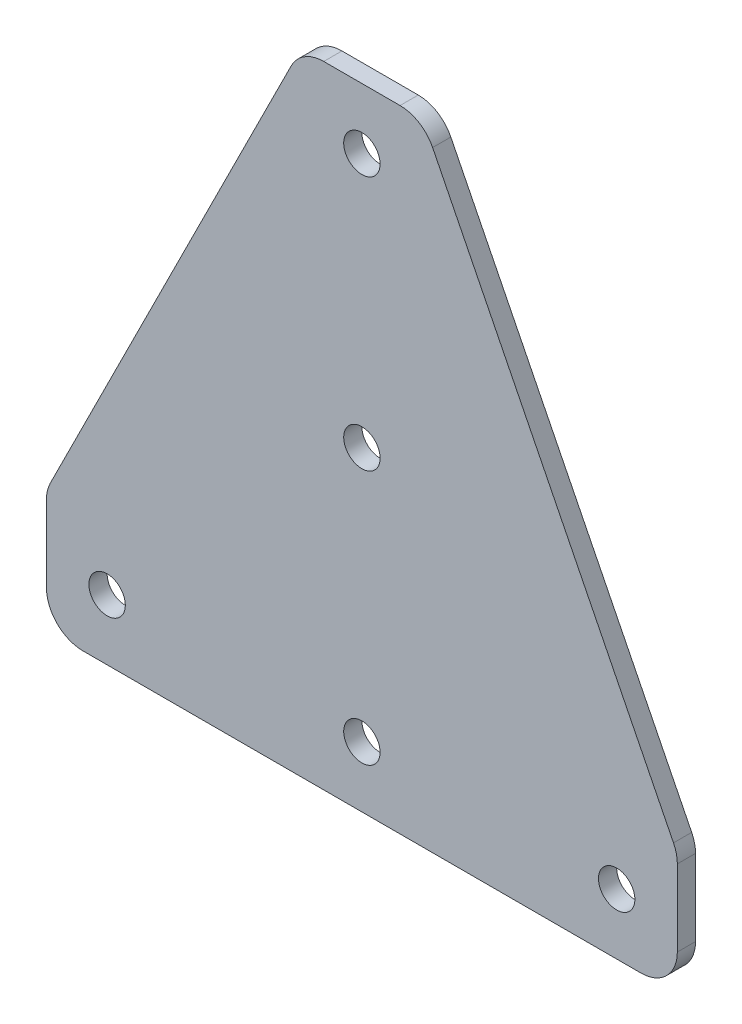
ISO-10303-21;
HEADER;
FILE_DESCRIPTION(('STEP AP214'),'2;1');
FILE_NAME('part.step','',(''),(''),'','','');
FILE_SCHEMA(('AUTOMOTIVE_DESIGN { 1 0 10303 214 1 1 1 1 }'));
ENDSEC;
DATA;
#1=APPLICATION_CONTEXT('core data for automotive mechanical design processes');
#2=APPLICATION_PROTOCOL_DEFINITION('international standard','automotive_design',2000,#1);
#3=PRODUCT_CONTEXT('',#1,'mechanical');
#4=PRODUCT('Part','Part','',(#3));
#5=PRODUCT_RELATED_PRODUCT_CATEGORY('part','',(#4));
#6=PRODUCT_DEFINITION_FORMATION('','',#4);
#7=PRODUCT_DEFINITION_CONTEXT('part definition',#1,'design');
#8=PRODUCT_DEFINITION('design','',#6,#7);
#9=PRODUCT_DEFINITION_SHAPE('','',#8);
#10=(LENGTH_UNIT() NAMED_UNIT(*) SI_UNIT(.MILLI.,.METRE.));
#11=(NAMED_UNIT(*) PLANE_ANGLE_UNIT() SI_UNIT($,.RADIAN.));
#12=(NAMED_UNIT(*) SI_UNIT($,.STERADIAN.) SOLID_ANGLE_UNIT());
#13=UNCERTAINTY_MEASURE_WITH_UNIT(LENGTH_MEASURE(1.E-05),#10,'distance_accuracy_value','');
#14=(GEOMETRIC_REPRESENTATION_CONTEXT(3) GLOBAL_UNCERTAINTY_ASSIGNED_CONTEXT((#13)) GLOBAL_UNIT_ASSIGNED_CONTEXT((#10,
#11,#12)) REPRESENTATION_CONTEXT('',''));
#15=CARTESIAN_POINT('',(0.,0.,0.));
#16=DIRECTION('',(0.,0.,1.));
#17=DIRECTION('',(1.,0.,0.));
#18=AXIS2_PLACEMENT_3D('',#15,#16,#17);
#19=CARTESIAN_POINT('',(0.,0.,1.5));
#20=DIRECTION('',(0.,0.,1.));
#21=DIRECTION('',(1.,0.,0.));
#22=AXIS2_PLACEMENT_3D('',#19,#20,#21);
#23=PLANE('',#22);
#24=DIRECTION('',(-1.,0.,0.));
#25=VECTOR('',#24,1.);
#26=CARTESIAN_POINT('',(-26.,47.,1.5));
#27=LINE('',#26,#25);
#28=CARTESIAN_POINT('',(3.14589803375032,47.,1.5));
#29=VERTEX_POINT('',#28);
#30=CARTESIAN_POINT('',(-3.14589803375032,47.,1.5));
#31=VERTEX_POINT('',#30);
#32=EDGE_CURVE('E124',#29,#31,#27,.T.);
#33=ORIENTED_EDGE('',*,*,#32,.T.);
#34=CARTESIAN_POINT('',(-3.14589803375032,44.,1.5));
#35=DIRECTION('',(0.,0.,1.));
#36=DIRECTION('',(1.,0.,0.));
#37=AXIS2_PLACEMENT_3D('',#34,#35,#36);
#38=CIRCLE('',#37,3.);
#39=CARTESIAN_POINT('',(-5.82917960675006,45.3416407864999,1.5));
#40=VERTEX_POINT('',#39);
#41=EDGE_CURVE('E159',#31,#40,#38,.T.);
#42=ORIENTED_EDGE('',*,*,#41,.T.);
#43=DIRECTION('',(0.447213595499958,0.894427190999916,0.));
#44=VECTOR('',#43,1.);
#45=CARTESIAN_POINT('',(-5.,47.,1.5));
#46=LINE('',#45,#44);
#47=CARTESIAN_POINT('',(-25.6832815729997,5.63343685400054,1.5));
#48=VERTEX_POINT('',#47);
#49=EDGE_CURVE('E251',#48,#40,#46,.T.);
#50=ORIENTED_EDGE('',*,*,#49,.F.);
#51=CARTESIAN_POINT('',(-23.,4.29179606750065,1.5));
#52=DIRECTION('',(0.,0.,1.));
#53=DIRECTION('',(1.,0.,0.));
#54=AXIS2_PLACEMENT_3D('',#51,#52,#53);
#55=CIRCLE('',#54,3.);
#56=CARTESIAN_POINT('',(-26.,4.29179606750067,1.5));
#57=VERTEX_POINT('',#56);
#58=EDGE_CURVE('E132',#48,#57,#55,.T.);
#59=ORIENTED_EDGE('',*,*,#58,.T.);
#60=DIRECTION('',(0.,-1.,0.));
#61=VECTOR('',#60,1.);
#62=CARTESIAN_POINT('',(-26.,47.,1.5));
#63=LINE('',#62,#61);
#64=CARTESIAN_POINT('',(-26.,-1.99999999999998,1.5));
#65=VERTEX_POINT('',#64);
#66=EDGE_CURVE('E193',#57,#65,#63,.T.);
#67=ORIENTED_EDGE('',*,*,#66,.T.);
#68=CARTESIAN_POINT('',(-23.,-2.,1.5));
#69=DIRECTION('',(0.,0.,1.));
#70=DIRECTION('',(1.,0.,0.));
#71=AXIS2_PLACEMENT_3D('',#68,#69,#70);
#72=CIRCLE('',#71,3.);
#73=CARTESIAN_POINT('',(-23.,-5.,1.5));
#74=VERTEX_POINT('',#73);
#75=EDGE_CURVE('E148',#65,#74,#72,.T.);
#76=ORIENTED_EDGE('',*,*,#75,.T.);
#77=DIRECTION('',(1.,0.,0.));
#78=VECTOR('',#77,1.);
#79=CARTESIAN_POINT('',(-26.,-5.,1.5));
#80=LINE('',#79,#78);
#81=CARTESIAN_POINT('',(23.,-5.,1.5));
#82=VERTEX_POINT('',#81);
#83=EDGE_CURVE('E200',#74,#82,#80,.T.);
#84=ORIENTED_EDGE('',*,*,#83,.T.);
#85=CARTESIAN_POINT('',(23.,-1.99999999999999,1.5));
#86=DIRECTION('',(0.,0.,1.));
#87=DIRECTION('',(1.,0.,0.));
#88=AXIS2_PLACEMENT_3D('',#85,#86,#87);
#89=CIRCLE('',#88,3.);
#90=CARTESIAN_POINT('',(26.,-1.99999999999998,1.5));
#91=VERTEX_POINT('',#90);
#92=EDGE_CURVE('E157',#82,#91,#89,.T.);
#93=ORIENTED_EDGE('',*,*,#92,.T.);
#94=DIRECTION('',(0.,1.,0.));
#95=VECTOR('',#94,1.);
#96=CARTESIAN_POINT('',(26.,47.,1.5));
#97=LINE('',#96,#95);
#98=CARTESIAN_POINT('',(26.,4.29179606750065,1.5));
#99=VERTEX_POINT('',#98);
#100=EDGE_CURVE('E142',#91,#99,#97,.T.);
#101=ORIENTED_EDGE('',*,*,#100,.T.);
#102=CARTESIAN_POINT('',(23.,4.29179606750064,1.5));
#103=DIRECTION('',(0.,0.,1.));
#104=DIRECTION('',(1.,0.,0.));
#105=AXIS2_PLACEMENT_3D('',#102,#103,#104);
#106=CIRCLE('',#105,3.);
#107=CARTESIAN_POINT('',(25.6832815729997,5.63343685400051,1.5));
#108=VERTEX_POINT('',#107);
#109=EDGE_CURVE('E131',#99,#108,#106,.T.);
#110=ORIENTED_EDGE('',*,*,#109,.T.);
#111=DIRECTION('',(0.447213595499958,-0.894427190999916,0.));
#112=VECTOR('',#111,1.);
#113=CARTESIAN_POINT('',(26.,5.,1.5));
#114=LINE('',#113,#112);
#115=CARTESIAN_POINT('',(5.82917960675006,45.3416407864999,1.5));
#116=VERTEX_POINT('',#115);
#117=EDGE_CURVE('E126',#116,#108,#114,.T.);
#118=ORIENTED_EDGE('',*,*,#117,.F.);
#119=CARTESIAN_POINT('',(3.14589803375032,44.,1.5));
#120=DIRECTION('',(0.,0.,1.));
#121=DIRECTION('',(1.,0.,0.));
#122=AXIS2_PLACEMENT_3D('',#119,#120,#121);
#123=CIRCLE('',#122,3.);
#124=EDGE_CURVE('E121',#116,#29,#123,.T.);
#125=ORIENTED_EDGE('',*,*,#124,.T.);
#126=EDGE_LOOP('',(#33,#42,#50,#59,#67,#76,#84,#93,#101,#110,#118,#125));
#127=FACE_BOUND('',#126,.T.);
#128=CARTESIAN_POINT('',(0.,42.,1.5));
#129=DIRECTION('',(0.,0.,1.));
#130=DIRECTION('',(1.,0.,0.));
#131=AXIS2_PLACEMENT_3D('',#128,#129,#130);
#132=CIRCLE('',#131,1.5);
#133=CARTESIAN_POINT('',(1.5,42.,1.5));
#134=VERTEX_POINT('',#133);
#135=EDGE_CURVE('E236',#134,#134,#132,.T.);
#136=ORIENTED_EDGE('',*,*,#135,.F.);
#137=EDGE_LOOP('',(#136));
#138=FACE_BOUND('',#137,.T.);
#139=CARTESIAN_POINT('',(0.,0.,1.5));
#140=DIRECTION('',(0.,0.,1.));
#141=DIRECTION('',(1.,0.,0.));
#142=AXIS2_PLACEMENT_3D('',#139,#140,#141);
#143=CIRCLE('',#142,1.5);
#144=CARTESIAN_POINT('',(1.5,0.,1.5));
#145=VERTEX_POINT('',#144);
#146=EDGE_CURVE('E224',#145,#145,#143,.T.);
#147=ORIENTED_EDGE('',*,*,#146,.F.);
#148=EDGE_LOOP('',(#147));
#149=FACE_BOUND('',#148,.T.);
#150=CARTESIAN_POINT('',(-21.,0.,1.5));
#151=DIRECTION('',(0.,0.,1.));
#152=DIRECTION('',(1.,0.,0.));
#153=AXIS2_PLACEMENT_3D('',#150,#151,#152);
#154=CIRCLE('',#153,1.5);
#155=CARTESIAN_POINT('',(-19.5,0.,1.5));
#156=VERTEX_POINT('',#155);
#157=EDGE_CURVE('E215',#156,#156,#154,.T.);
#158=ORIENTED_EDGE('',*,*,#157,.F.);
#159=EDGE_LOOP('',(#158));
#160=FACE_BOUND('',#159,.T.);
#161=CARTESIAN_POINT('',(21.,0.,1.5));
#162=DIRECTION('',(0.,0.,1.));
#163=DIRECTION('',(1.,0.,0.));
#164=AXIS2_PLACEMENT_3D('',#161,#162,#163);
#165=CIRCLE('',#164,1.5);
#166=CARTESIAN_POINT('',(22.5,0.,1.5));
#167=VERTEX_POINT('',#166);
#168=EDGE_CURVE('E230',#167,#167,#165,.T.);
#169=ORIENTED_EDGE('',*,*,#168,.F.);
#170=EDGE_LOOP('',(#169));
#171=FACE_BOUND('',#170,.T.);
#172=CARTESIAN_POINT('',(0.,21.,1.5));
#173=DIRECTION('',(0.,0.,1.));
#174=DIRECTION('',(1.,0.,0.));
#175=AXIS2_PLACEMENT_3D('',#172,#173,#174);
#176=CIRCLE('',#175,1.5);
#177=CARTESIAN_POINT('',(1.5,21.,1.5));
#178=VERTEX_POINT('',#177);
#179=EDGE_CURVE('E242',#178,#178,#176,.T.);
#180=ORIENTED_EDGE('',*,*,#179,.F.);
#181=EDGE_LOOP('',(#180));
#182=FACE_BOUND('',#181,.T.);
#183=ADVANCED_FACE('F33',(#127,#138,#149,#160,#171,#182),#23,.T.);
#184=CARTESIAN_POINT('',(0.,0.,0.));
#185=DIRECTION('',(0.,0.,1.));
#186=DIRECTION('',(1.,0.,0.));
#187=AXIS2_PLACEMENT_3D('',#184,#185,#186);
#188=PLANE('',#187);
#189=CARTESIAN_POINT('',(0.,42.,0.));
#190=DIRECTION('',(0.,0.,1.));
#191=DIRECTION('',(1.,0.,0.));
#192=AXIS2_PLACEMENT_3D('',#189,#190,#191);
#193=CIRCLE('',#192,1.5);
#194=CARTESIAN_POINT('',(1.5,42.,0.));
#195=VERTEX_POINT('',#194);
#196=EDGE_CURVE('E239',#195,#195,#193,.T.);
#197=ORIENTED_EDGE('',*,*,#196,.T.);
#198=EDGE_LOOP('',(#197));
#199=FACE_BOUND('',#198,.T.);
#200=CARTESIAN_POINT('',(0.,0.,0.));
#201=DIRECTION('',(0.,0.,1.));
#202=DIRECTION('',(1.,0.,0.));
#203=AXIS2_PLACEMENT_3D('',#200,#201,#202);
#204=CIRCLE('',#203,1.5);
#205=CARTESIAN_POINT('',(1.5,0.,0.));
#206=VERTEX_POINT('',#205);
#207=EDGE_CURVE('E227',#206,#206,#204,.T.);
#208=ORIENTED_EDGE('',*,*,#207,.T.);
#209=EDGE_LOOP('',(#208));
#210=FACE_BOUND('',#209,.T.);
#211=DIRECTION('',(0.447213595499958,0.894427190999916,0.));
#212=VECTOR('',#211,1.);
#213=CARTESIAN_POINT('',(-5.,47.,0.));
#214=LINE('',#213,#212);
#215=CARTESIAN_POINT('',(-25.6832815729997,5.63343685400054,0.));
#216=VERTEX_POINT('',#215);
#217=CARTESIAN_POINT('',(-5.82917960675006,45.3416407864999,0.));
#218=VERTEX_POINT('',#217);
#219=EDGE_CURVE('E248',#216,#218,#214,.T.);
#220=ORIENTED_EDGE('',*,*,#219,.T.);
#221=CARTESIAN_POINT('',(-3.14589803375032,44.,0.));
#222=DIRECTION('',(0.,0.,1.));
#223=DIRECTION('',(1.,0.,0.));
#224=AXIS2_PLACEMENT_3D('',#221,#222,#223);
#225=CIRCLE('',#224,3.);
#226=CARTESIAN_POINT('',(-3.14589803375032,47.,0.));
#227=VERTEX_POINT('',#226);
#228=EDGE_CURVE('E174',#218,#227,#225,.F.);
#229=ORIENTED_EDGE('',*,*,#228,.T.);
#230=DIRECTION('',(-1.,0.,0.));
#231=VECTOR('',#230,1.);
#232=CARTESIAN_POINT('',(-26.,47.,0.));
#233=LINE('',#232,#231);
#234=CARTESIAN_POINT('',(3.14589803375032,47.,0.));
#235=VERTEX_POINT('',#234);
#236=EDGE_CURVE('E151',#235,#227,#233,.T.);
#237=ORIENTED_EDGE('',*,*,#236,.F.);
#238=CARTESIAN_POINT('',(3.14589803375032,44.,0.));
#239=DIRECTION('',(0.,0.,1.));
#240=DIRECTION('',(1.,0.,0.));
#241=AXIS2_PLACEMENT_3D('',#238,#239,#240);
#242=CIRCLE('',#241,3.);
#243=CARTESIAN_POINT('',(5.82917960675006,45.3416407864999,0.));
#244=VERTEX_POINT('',#243);
#245=EDGE_CURVE('E146',#235,#244,#242,.F.);
#246=ORIENTED_EDGE('',*,*,#245,.T.);
#247=DIRECTION('',(0.447213595499958,-0.894427190999916,0.));
#248=VECTOR('',#247,1.);
#249=CARTESIAN_POINT('',(26.,5.,0.));
#250=LINE('',#249,#248);
#251=CARTESIAN_POINT('',(25.6832815729997,5.63343685400051,0.));
#252=VERTEX_POINT('',#251);
#253=EDGE_CURVE('E254',#244,#252,#250,.T.);
#254=ORIENTED_EDGE('',*,*,#253,.T.);
#255=CARTESIAN_POINT('',(23.,4.29179606750064,0.));
#256=DIRECTION('',(0.,0.,1.));
#257=DIRECTION('',(1.,0.,0.));
#258=AXIS2_PLACEMENT_3D('',#255,#256,#257);
#259=CIRCLE('',#258,3.);
#260=CARTESIAN_POINT('',(26.,4.29179606750065,0.));
#261=VERTEX_POINT('',#260);
#262=EDGE_CURVE('E170',#252,#261,#259,.F.);
#263=ORIENTED_EDGE('',*,*,#262,.T.);
#264=DIRECTION('',(0.,1.,0.));
#265=VECTOR('',#264,1.);
#266=CARTESIAN_POINT('',(26.,47.,0.));
#267=LINE('',#266,#265);
#268=CARTESIAN_POINT('',(26.,-1.99999999999998,0.));
#269=VERTEX_POINT('',#268);
#270=EDGE_CURVE('E212',#269,#261,#267,.T.);
#271=ORIENTED_EDGE('',*,*,#270,.F.);
#272=CARTESIAN_POINT('',(23.,-1.99999999999999,0.));
#273=DIRECTION('',(0.,0.,1.));
#274=DIRECTION('',(1.,0.,0.));
#275=AXIS2_PLACEMENT_3D('',#272,#273,#274);
#276=CIRCLE('',#275,3.);
#277=CARTESIAN_POINT('',(23.,-5.,0.));
#278=VERTEX_POINT('',#277);
#279=EDGE_CURVE('E172',#269,#278,#276,.F.);
#280=ORIENTED_EDGE('',*,*,#279,.T.);
#281=DIRECTION('',(1.,0.,0.));
#282=VECTOR('',#281,1.);
#283=CARTESIAN_POINT('',(-26.,-5.,0.));
#284=LINE('',#283,#282);
#285=CARTESIAN_POINT('',(-23.,-5.,0.));
#286=VERTEX_POINT('',#285);
#287=EDGE_CURVE('E206',#286,#278,#284,.T.);
#288=ORIENTED_EDGE('',*,*,#287,.F.);
#289=CARTESIAN_POINT('',(-23.,-2.,0.));
#290=DIRECTION('',(0.,0.,1.));
#291=DIRECTION('',(1.,0.,0.));
#292=AXIS2_PLACEMENT_3D('',#289,#290,#291);
#293=CIRCLE('',#292,3.);
#294=CARTESIAN_POINT('',(-26.,-1.99999999999998,0.));
#295=VERTEX_POINT('',#294);
#296=EDGE_CURVE('E48',#286,#295,#293,.F.);
#297=ORIENTED_EDGE('',*,*,#296,.T.);
#298=DIRECTION('',(0.,-1.,0.));
#299=VECTOR('',#298,1.);
#300=CARTESIAN_POINT('',(-26.,47.,0.));
#301=LINE('',#300,#299);
#302=CARTESIAN_POINT('',(-26.,4.29179606750067,0.));
#303=VERTEX_POINT('',#302);
#304=EDGE_CURVE('E194',#303,#295,#301,.T.);
#305=ORIENTED_EDGE('',*,*,#304,.F.);
#306=CARTESIAN_POINT('',(-23.,4.29179606750065,0.));
#307=DIRECTION('',(0.,0.,1.));
#308=DIRECTION('',(1.,0.,0.));
#309=AXIS2_PLACEMENT_3D('',#306,#307,#308);
#310=CIRCLE('',#309,3.);
#311=EDGE_CURVE('E167',#303,#216,#310,.F.);
#312=ORIENTED_EDGE('',*,*,#311,.T.);
#313=EDGE_LOOP('',(#220,#229,#237,#246,#254,#263,#271,#280,#288,#297,#305,#312));
#314=FACE_BOUND('',#313,.T.);
#315=CARTESIAN_POINT('',(-21.,0.,0.));
#316=DIRECTION('',(0.,0.,1.));
#317=DIRECTION('',(1.,0.,0.));
#318=AXIS2_PLACEMENT_3D('',#315,#316,#317);
#319=CIRCLE('',#318,1.5);
#320=CARTESIAN_POINT('',(-19.5,0.,0.));
#321=VERTEX_POINT('',#320);
#322=EDGE_CURVE('E221',#321,#321,#319,.T.);
#323=ORIENTED_EDGE('',*,*,#322,.T.);
#324=EDGE_LOOP('',(#323));
#325=FACE_BOUND('',#324,.T.);
#326=CARTESIAN_POINT('',(21.,0.,0.));
#327=DIRECTION('',(0.,0.,1.));
#328=DIRECTION('',(1.,0.,0.));
#329=AXIS2_PLACEMENT_3D('',#326,#327,#328);
#330=CIRCLE('',#329,1.5);
#331=CARTESIAN_POINT('',(22.5,0.,0.));
#332=VERTEX_POINT('',#331);
#333=EDGE_CURVE('E233',#332,#332,#330,.T.);
#334=ORIENTED_EDGE('',*,*,#333,.T.);
#335=EDGE_LOOP('',(#334));
#336=FACE_BOUND('',#335,.T.);
#337=CARTESIAN_POINT('',(0.,21.,0.));
#338=DIRECTION('',(0.,0.,1.));
#339=DIRECTION('',(1.,0.,0.));
#340=AXIS2_PLACEMENT_3D('',#337,#338,#339);
#341=CIRCLE('',#340,1.5);
#342=CARTESIAN_POINT('',(1.5,21.,0.));
#343=VERTEX_POINT('',#342);
#344=EDGE_CURVE('E245',#343,#343,#341,.T.);
#345=ORIENTED_EDGE('',*,*,#344,.T.);
#346=EDGE_LOOP('',(#345));
#347=FACE_BOUND('',#346,.T.);
#348=ADVANCED_FACE('F209',(#199,#210,#314,#325,#336,#347),#188,.F.);
#349=CARTESIAN_POINT('',(-26.,47.,1.5));
#350=DIRECTION('',(1.,0.,0.));
#351=DIRECTION('',(0.,1.,0.));
#352=AXIS2_PLACEMENT_3D('',#349,#350,#351);
#353=PLANE('',#352);
#354=ORIENTED_EDGE('',*,*,#66,.F.);
#355=DIRECTION('',(0.,0.,1.));
#356=VECTOR('',#355,1.);
#357=CARTESIAN_POINT('',(-26.,4.29179606750065,1.5));
#358=LINE('',#357,#356);
#359=EDGE_CURVE('E11',#57,#303,#358,.F.);
#360=ORIENTED_EDGE('',*,*,#359,.T.);
#361=ORIENTED_EDGE('',*,*,#304,.T.);
#362=DIRECTION('',(0.,0.,-1.));
#363=VECTOR('',#362,1.);
#364=CARTESIAN_POINT('',(-26.,-1.99999999999999,1.5));
#365=LINE('',#364,#363);
#366=EDGE_CURVE('E41',#295,#65,#365,.F.);
#367=ORIENTED_EDGE('',*,*,#366,.T.);
#368=EDGE_LOOP('',(#354,#360,#361,#367));
#369=FACE_BOUND('',#368,.T.);
#370=ADVANCED_FACE('F192',(#369),#353,.F.);
#371=CARTESIAN_POINT('',(-26.,-5.,1.5));
#372=DIRECTION('',(0.,1.,0.));
#373=DIRECTION('',(0.,0.,1.));
#374=AXIS2_PLACEMENT_3D('',#371,#372,#373);
#375=PLANE('',#374);
#376=ORIENTED_EDGE('',*,*,#287,.T.);
#377=DIRECTION('',(0.,0.,-1.));
#378=VECTOR('',#377,1.);
#379=CARTESIAN_POINT('',(23.,-5.,1.5));
#380=LINE('',#379,#378);
#381=EDGE_CURVE('E185',#278,#82,#380,.F.);
#382=ORIENTED_EDGE('',*,*,#381,.T.);
#383=ORIENTED_EDGE('',*,*,#83,.F.);
#384=DIRECTION('',(0.,0.,-1.));
#385=VECTOR('',#384,1.);
#386=CARTESIAN_POINT('',(-23.,-5.,1.5));
#387=LINE('',#386,#385);
#388=EDGE_CURVE('E182',#74,#286,#387,.T.);
#389=ORIENTED_EDGE('',*,*,#388,.T.);
#390=EDGE_LOOP('',(#376,#382,#383,#389));
#391=FACE_BOUND('',#390,.T.);
#392=ADVANCED_FACE('F205',(#391),#375,.F.);
#393=CARTESIAN_POINT('',(26.,47.,1.5));
#394=DIRECTION('',(-1.,0.,0.));
#395=DIRECTION('',(0.,-1.,0.));
#396=AXIS2_PLACEMENT_3D('',#393,#394,#395);
#397=PLANE('',#396);
#398=ORIENTED_EDGE('',*,*,#100,.F.);
#399=DIRECTION('',(0.,0.,-1.));
#400=VECTOR('',#399,1.);
#401=CARTESIAN_POINT('',(26.,-1.99999999999999,1.5));
#402=LINE('',#401,#400);
#403=EDGE_CURVE('E179',#91,#269,#402,.T.);
#404=ORIENTED_EDGE('',*,*,#403,.T.);
#405=ORIENTED_EDGE('',*,*,#270,.T.);
#406=DIRECTION('',(0.,0.,1.));
#407=VECTOR('',#406,1.);
#408=CARTESIAN_POINT('',(26.,4.29179606750064,1.5));
#409=LINE('',#408,#407);
#410=EDGE_CURVE('E176',#261,#99,#409,.T.);
#411=ORIENTED_EDGE('',*,*,#410,.T.);
#412=EDGE_LOOP('',(#398,#404,#405,#411));
#413=FACE_BOUND('',#412,.T.);
#414=ADVANCED_FACE('F267',(#413),#397,.F.);
#415=CARTESIAN_POINT('',(-26.,47.,1.5));
#416=DIRECTION('',(0.,-1.,0.));
#417=DIRECTION('',(0.,0.,-1.));
#418=AXIS2_PLACEMENT_3D('',#415,#416,#417);
#419=PLANE('',#418);
#420=ORIENTED_EDGE('',*,*,#236,.T.);
#421=DIRECTION('',(0.,0.,1.));
#422=VECTOR('',#421,1.);
#423=CARTESIAN_POINT('',(-3.14589803375032,47.,1.5));
#424=LINE('',#423,#422);
#425=EDGE_CURVE('E141',#227,#31,#424,.T.);
#426=ORIENTED_EDGE('',*,*,#425,.T.);
#427=ORIENTED_EDGE('',*,*,#32,.F.);
#428=DIRECTION('',(0.,0.,1.));
#429=VECTOR('',#428,1.);
#430=CARTESIAN_POINT('',(3.14589803375032,47.,1.5));
#431=LINE('',#430,#429);
#432=EDGE_CURVE('E138',#29,#235,#431,.F.);
#433=ORIENTED_EDGE('',*,*,#432,.T.);
#434=EDGE_LOOP('',(#420,#426,#427,#433));
#435=FACE_BOUND('',#434,.T.);
#436=ADVANCED_FACE('F137',(#435),#419,.F.);
#437=CARTESIAN_POINT('',(-21.,0.,1.5));
#438=DIRECTION('',(0.,0.,-1.));
#439=DIRECTION('',(-1.,0.,0.));
#440=AXIS2_PLACEMENT_3D('',#437,#438,#439);
#441=CYLINDRICAL_SURFACE('',#440,1.5);
#442=ORIENTED_EDGE('',*,*,#157,.T.);
#443=EDGE_LOOP('',(#442));
#444=FACE_BOUND('',#443,.T.);
#445=ORIENTED_EDGE('',*,*,#322,.F.);
#446=EDGE_LOOP('',(#445));
#447=FACE_BOUND('',#446,.T.);
#448=ADVANCED_FACE('F291',(#444,#447),#441,.F.);
#449=CARTESIAN_POINT('',(0.,0.,1.5));
#450=DIRECTION('',(0.,0.,-1.));
#451=DIRECTION('',(-1.,0.,0.));
#452=AXIS2_PLACEMENT_3D('',#449,#450,#451);
#453=CYLINDRICAL_SURFACE('',#452,1.5);
#454=ORIENTED_EDGE('',*,*,#146,.T.);
#455=EDGE_LOOP('',(#454));
#456=FACE_BOUND('',#455,.T.);
#457=ORIENTED_EDGE('',*,*,#207,.F.);
#458=EDGE_LOOP('',(#457));
#459=FACE_BOUND('',#458,.T.);
#460=ADVANCED_FACE('F324',(#456,#459),#453,.F.);
#461=CARTESIAN_POINT('',(21.,0.,1.5));
#462=DIRECTION('',(0.,0.,-1.));
#463=DIRECTION('',(-1.,0.,0.));
#464=AXIS2_PLACEMENT_3D('',#461,#462,#463);
#465=CYLINDRICAL_SURFACE('',#464,1.5);
#466=ORIENTED_EDGE('',*,*,#168,.T.);
#467=EDGE_LOOP('',(#466));
#468=FACE_BOUND('',#467,.T.);
#469=ORIENTED_EDGE('',*,*,#333,.F.);
#470=EDGE_LOOP('',(#469));
#471=FACE_BOUND('',#470,.T.);
#472=ADVANCED_FACE('F331',(#468,#471),#465,.F.);
#473=CARTESIAN_POINT('',(0.,42.,1.5));
#474=DIRECTION('',(0.,0.,-1.));
#475=DIRECTION('',(-1.,0.,0.));
#476=AXIS2_PLACEMENT_3D('',#473,#474,#475);
#477=CYLINDRICAL_SURFACE('',#476,1.5);
#478=ORIENTED_EDGE('',*,*,#135,.T.);
#479=EDGE_LOOP('',(#478));
#480=FACE_BOUND('',#479,.T.);
#481=ORIENTED_EDGE('',*,*,#196,.F.);
#482=EDGE_LOOP('',(#481));
#483=FACE_BOUND('',#482,.T.);
#484=ADVANCED_FACE('F338',(#480,#483),#477,.F.);
#485=CARTESIAN_POINT('',(0.,21.,1.5));
#486=DIRECTION('',(0.,0.,-1.));
#487=DIRECTION('',(-1.,0.,0.));
#488=AXIS2_PLACEMENT_3D('',#485,#486,#487);
#489=CYLINDRICAL_SURFACE('',#488,1.5);
#490=ORIENTED_EDGE('',*,*,#179,.T.);
#491=EDGE_LOOP('',(#490));
#492=FACE_BOUND('',#491,.T.);
#493=ORIENTED_EDGE('',*,*,#344,.F.);
#494=EDGE_LOOP('',(#493));
#495=FACE_BOUND('',#494,.T.);
#496=ADVANCED_FACE('F346',(#492,#495),#489,.F.);
#497=CARTESIAN_POINT('',(-5.,47.,0.));
#498=DIRECTION('',(0.894427190999916,-0.447213595499958,0.));
#499=DIRECTION('',(0.447213595499958,0.894427190999916,0.));
#500=AXIS2_PLACEMENT_3D('',#497,#498,#499);
#501=PLANE('',#500);
#502=ORIENTED_EDGE('',*,*,#49,.T.);
#503=DIRECTION('',(0.,0.,1.));
#504=VECTOR('',#503,1.);
#505=CARTESIAN_POINT('',(-5.82917960675006,45.3416407864999,0.));
#506=LINE('',#505,#504);
#507=EDGE_CURVE('E164',#40,#218,#506,.F.);
#508=ORIENTED_EDGE('',*,*,#507,.T.);
#509=ORIENTED_EDGE('',*,*,#219,.F.);
#510=DIRECTION('',(0.,0.,1.));
#511=VECTOR('',#510,1.);
#512=CARTESIAN_POINT('',(-25.6832815729997,5.63343685400052,0.));
#513=LINE('',#512,#511);
#514=EDGE_CURVE('E161',#216,#48,#513,.T.);
#515=ORIENTED_EDGE('',*,*,#514,.T.);
#516=EDGE_LOOP('',(#502,#508,#509,#515));
#517=FACE_BOUND('',#516,.T.);
#518=ADVANCED_FACE('F354',(#517),#501,.F.);
#519=CARTESIAN_POINT('',(26.,5.,0.));
#520=DIRECTION('',(-0.894427190999916,-0.447213595499958,0.));
#521=DIRECTION('',(0.447213595499958,-0.894427190999916,0.));
#522=AXIS2_PLACEMENT_3D('',#519,#520,#521);
#523=PLANE('',#522);
#524=ORIENTED_EDGE('',*,*,#117,.T.);
#525=DIRECTION('',(0.,0.,1.));
#526=VECTOR('',#525,1.);
#527=CARTESIAN_POINT('',(25.6832815729997,5.63343685400051,0.));
#528=LINE('',#527,#526);
#529=EDGE_CURVE('E189',#108,#252,#528,.F.);
#530=ORIENTED_EDGE('',*,*,#529,.T.);
#531=ORIENTED_EDGE('',*,*,#253,.F.);
#532=DIRECTION('',(0.,0.,1.));
#533=VECTOR('',#532,1.);
#534=CARTESIAN_POINT('',(5.82917960675007,45.3416407864999,0.));
#535=LINE('',#534,#533);
#536=EDGE_CURVE('E187',#244,#116,#535,.T.);
#537=ORIENTED_EDGE('',*,*,#536,.T.);
#538=EDGE_LOOP('',(#524,#530,#531,#537));
#539=FACE_BOUND('',#538,.T.);
#540=ADVANCED_FACE('F280',(#539),#523,.F.);
#541=CARTESIAN_POINT('',(-3.14589803375032,44.,1.5));
#542=DIRECTION('',(0.,0.,1.));
#543=DIRECTION('',(1.,0.,0.));
#544=AXIS2_PLACEMENT_3D('',#541,#542,#543);
#545=CYLINDRICAL_SURFACE('',#544,3.);
#546=ORIENTED_EDGE('',*,*,#228,.F.);
#547=ORIENTED_EDGE('',*,*,#507,.F.);
#548=ORIENTED_EDGE('',*,*,#41,.F.);
#549=ORIENTED_EDGE('',*,*,#425,.F.);
#550=EDGE_LOOP('',(#546,#547,#548,#549));
#551=FACE_BOUND('',#550,.T.);
#552=ADVANCED_FACE('F273',(#551),#545,.T.);
#553=CARTESIAN_POINT('',(23.,-1.99999999999999,1.5));
#554=DIRECTION('',(0.,0.,-1.));
#555=DIRECTION('',(-1.,0.,0.));
#556=AXIS2_PLACEMENT_3D('',#553,#554,#555);
#557=CYLINDRICAL_SURFACE('',#556,3.);
#558=ORIENTED_EDGE('',*,*,#92,.F.);
#559=ORIENTED_EDGE('',*,*,#381,.F.);
#560=ORIENTED_EDGE('',*,*,#279,.F.);
#561=ORIENTED_EDGE('',*,*,#403,.F.);
#562=EDGE_LOOP('',(#558,#559,#560,#561));
#563=FACE_BOUND('',#562,.T.);
#564=ADVANCED_FACE('F271',(#563),#557,.T.);
#565=CARTESIAN_POINT('',(23.,4.29179606750064,1.5));
#566=DIRECTION('',(0.,0.,1.));
#567=DIRECTION('',(1.,0.,0.));
#568=AXIS2_PLACEMENT_3D('',#565,#566,#567);
#569=CYLINDRICAL_SURFACE('',#568,3.);
#570=ORIENTED_EDGE('',*,*,#262,.F.);
#571=ORIENTED_EDGE('',*,*,#529,.F.);
#572=ORIENTED_EDGE('',*,*,#109,.F.);
#573=ORIENTED_EDGE('',*,*,#410,.F.);
#574=EDGE_LOOP('',(#570,#571,#572,#573));
#575=FACE_BOUND('',#574,.T.);
#576=ADVANCED_FACE('F264',(#575),#569,.T.);
#577=CARTESIAN_POINT('',(3.14589803375032,44.,0.));
#578=DIRECTION('',(0.,0.,1.));
#579=DIRECTION('',(1.,0.,0.));
#580=AXIS2_PLACEMENT_3D('',#577,#578,#579);
#581=CYLINDRICAL_SURFACE('',#580,3.);
#582=ORIENTED_EDGE('',*,*,#245,.F.);
#583=ORIENTED_EDGE('',*,*,#432,.F.);
#584=ORIENTED_EDGE('',*,*,#124,.F.);
#585=ORIENTED_EDGE('',*,*,#536,.F.);
#586=EDGE_LOOP('',(#582,#583,#584,#585));
#587=FACE_BOUND('',#586,.T.);
#588=ADVANCED_FACE('F145',(#587),#581,.T.);
#589=CARTESIAN_POINT('',(-23.,4.29179606750065,0.));
#590=DIRECTION('',(0.,0.,1.));
#591=DIRECTION('',(1.,0.,0.));
#592=AXIS2_PLACEMENT_3D('',#589,#590,#591);
#593=CYLINDRICAL_SURFACE('',#592,3.);
#594=ORIENTED_EDGE('',*,*,#311,.F.);
#595=ORIENTED_EDGE('',*,*,#359,.F.);
#596=ORIENTED_EDGE('',*,*,#58,.F.);
#597=ORIENTED_EDGE('',*,*,#514,.F.);
#598=EDGE_LOOP('',(#594,#595,#596,#597));
#599=FACE_BOUND('',#598,.T.);
#600=ADVANCED_FACE('F391',(#599),#593,.T.);
#601=CARTESIAN_POINT('',(-23.,-2.,1.5));
#602=DIRECTION('',(0.,0.,-1.));
#603=DIRECTION('',(-1.,0.,0.));
#604=AXIS2_PLACEMENT_3D('',#601,#602,#603);
#605=CYLINDRICAL_SURFACE('',#604,3.);
#606=ORIENTED_EDGE('',*,*,#75,.F.);
#607=ORIENTED_EDGE('',*,*,#366,.F.);
#608=ORIENTED_EDGE('',*,*,#296,.F.);
#609=ORIENTED_EDGE('',*,*,#388,.F.);
#610=EDGE_LOOP('',(#606,#607,#608,#609));
#611=FACE_BOUND('',#610,.T.);
#612=ADVANCED_FACE('F35',(#611),#605,.T.);
#613=CLOSED_SHELL('',(#183,#348,#370,#392,#414,#436,#448,#460,#472,#484,#496,#518,#540,#552,
#564,#576,#588,#600,#612));
#614=MANIFOLD_SOLID_BREP('B2',#613);
#615=ADVANCED_BREP_SHAPE_REPRESENTATION('',(#18,#614),#14);
#616=SHAPE_DEFINITION_REPRESENTATION(#9,#615);
ENDSEC;
END-ISO-10303-21;
